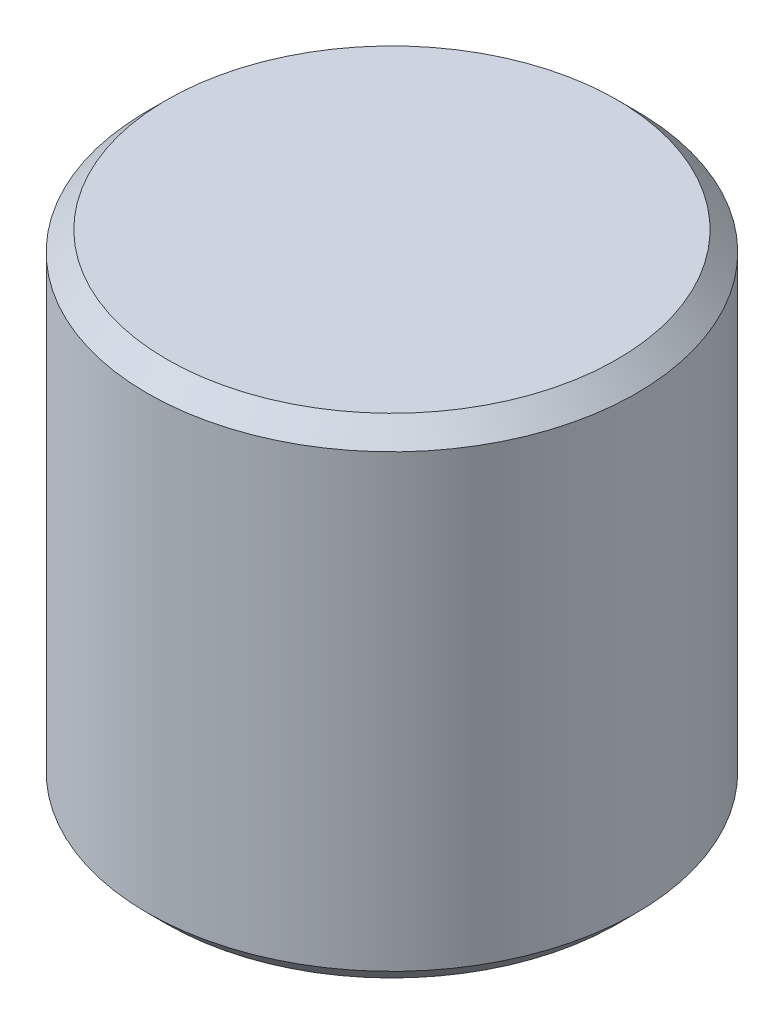
ISO-10303-21;
HEADER;
FILE_DESCRIPTION(('STEP AP214'),'2;1');
FILE_NAME('part.step','',(''),(''),'','','');
FILE_SCHEMA(('AUTOMOTIVE_DESIGN { 1 0 10303 214 1 1 1 1 }'));
ENDSEC;
DATA;
#1=APPLICATION_CONTEXT('core data for automotive mechanical design processes');
#2=APPLICATION_PROTOCOL_DEFINITION('international standard','automotive_design',2000,#1);
#3=PRODUCT_CONTEXT('',#1,'mechanical');
#4=PRODUCT('Part','Part','',(#3));
#5=PRODUCT_RELATED_PRODUCT_CATEGORY('part','',(#4));
#6=PRODUCT_DEFINITION_FORMATION('','',#4);
#7=PRODUCT_DEFINITION_CONTEXT('part definition',#1,'design');
#8=PRODUCT_DEFINITION('design','',#6,#7);
#9=PRODUCT_DEFINITION_SHAPE('','',#8);
#10=(LENGTH_UNIT() NAMED_UNIT(*) SI_UNIT(.MILLI.,.METRE.));
#11=(NAMED_UNIT(*) PLANE_ANGLE_UNIT() SI_UNIT($,.RADIAN.));
#12=(NAMED_UNIT(*) SI_UNIT($,.STERADIAN.) SOLID_ANGLE_UNIT());
#13=UNCERTAINTY_MEASURE_WITH_UNIT(LENGTH_MEASURE(1.E-05),#10,'distance_accuracy_value','');
#14=(GEOMETRIC_REPRESENTATION_CONTEXT(3) GLOBAL_UNCERTAINTY_ASSIGNED_CONTEXT((#13)) GLOBAL_UNIT_ASSIGNED_CONTEXT((#10,
#11,#12)) REPRESENTATION_CONTEXT('',''));
#15=CARTESIAN_POINT('',(0.,0.,0.));
#16=DIRECTION('',(0.,0.,1.));
#17=DIRECTION('',(1.,0.,0.));
#18=AXIS2_PLACEMENT_3D('',#15,#16,#17);
#19=CARTESIAN_POINT('',(0.,15.875,0.));
#20=DIRECTION('',(0.,-1.,0.));
#21=DIRECTION('',(0.,0.,-1.));
#22=AXIS2_PLACEMENT_3D('',#19,#20,#21);
#23=CYLINDRICAL_SURFACE('',#22,7.9375);
#24=CARTESIAN_POINT('',(0.,0.634999999999995,0.));
#25=DIRECTION('',(0.,1.,0.));
#26=DIRECTION('',(0.,0.,1.));
#27=AXIS2_PLACEMENT_3D('',#24,#25,#26);
#28=CIRCLE('',#27,7.9375);
#29=CARTESIAN_POINT('',(0.,0.634999999999995,7.9375));
#30=VERTEX_POINT('',#29);
#31=EDGE_CURVE('E59',#30,#30,#28,.T.);
#32=ORIENTED_EDGE('',*,*,#31,.T.);
#33=EDGE_LOOP('',(#32));
#34=FACE_BOUND('',#33,.T.);
#35=CARTESIAN_POINT('',(0.,15.24,0.));
#36=DIRECTION('',(0.,1.,0.));
#37=DIRECTION('',(0.,0.,1.));
#38=AXIS2_PLACEMENT_3D('',#35,#36,#37);
#39=CIRCLE('',#38,7.9375);
#40=CARTESIAN_POINT('',(0.,15.24,7.9375));
#41=VERTEX_POINT('',#40);
#42=EDGE_CURVE('E64',#41,#41,#39,.F.);
#43=ORIENTED_EDGE('',*,*,#42,.T.);
#44=EDGE_LOOP('',(#43));
#45=FACE_BOUND('',#44,.T.);
#46=ADVANCED_FACE('F45',(#34,#45),#23,.T.);
#47=CARTESIAN_POINT('',(0.,15.875,0.));
#48=DIRECTION('',(0.,1.,0.));
#49=DIRECTION('',(0.,0.,1.));
#50=AXIS2_PLACEMENT_3D('',#47,#48,#49);
#51=PLANE('',#50);
#52=CARTESIAN_POINT('',(0.,15.875,0.));
#53=DIRECTION('',(0.,1.,0.));
#54=DIRECTION('',(0.,0.,1.));
#55=AXIS2_PLACEMENT_3D('',#52,#53,#54);
#56=CIRCLE('',#55,7.3025);
#57=CARTESIAN_POINT('',(0.,15.875,7.3025));
#58=VERTEX_POINT('',#57);
#59=EDGE_CURVE('E10',#58,#58,#56,.T.);
#60=ORIENTED_EDGE('',*,*,#59,.T.);
#61=EDGE_LOOP('',(#60));
#62=FACE_BOUND('',#61,.T.);
#63=ADVANCED_FACE('F81',(#62),#51,.T.);
#64=CARTESIAN_POINT('',(0.,0.,0.));
#65=DIRECTION('',(0.,1.,0.));
#66=DIRECTION('',(0.,0.,1.));
#67=AXIS2_PLACEMENT_3D('',#64,#65,#66);
#68=PLANE('',#67);
#69=CARTESIAN_POINT('',(0.,0.,0.));
#70=DIRECTION('',(0.,1.,0.));
#71=DIRECTION('',(0.,0.,1.));
#72=AXIS2_PLACEMENT_3D('',#69,#70,#71);
#73=CIRCLE('',#72,7.3025);
#74=CARTESIAN_POINT('',(0.,0.,7.3025));
#75=VERTEX_POINT('',#74);
#76=EDGE_CURVE('E54',#75,#75,#73,.F.);
#77=ORIENTED_EDGE('',*,*,#76,.T.);
#78=EDGE_LOOP('',(#77));
#79=FACE_BOUND('',#78,.T.);
#80=ADVANCED_FACE('F78',(#79),#68,.F.);
#81=CARTESIAN_POINT('',(0.,0.634999999999995,0.));
#82=DIRECTION('',(0.,1.,0.));
#83=DIRECTION('',(0.,0.,1.));
#84=AXIS2_PLACEMENT_3D('',#81,#82,#83);
#85=CONICAL_SURFACE('',#84,7.9375,0.785398163397451);
#86=ORIENTED_EDGE('',*,*,#76,.F.);
#87=EDGE_LOOP('',(#86));
#88=FACE_BOUND('',#87,.T.);
#89=ORIENTED_EDGE('',*,*,#31,.F.);
#90=EDGE_LOOP('',(#89));
#91=FACE_BOUND('',#90,.T.);
#92=ADVANCED_FACE('F74',(#88,#91),#85,.T.);
#93=CARTESIAN_POINT('',(0.,15.875,0.));
#94=DIRECTION('',(0.,-1.,0.));
#95=DIRECTION('',(0.,0.,-1.));
#96=AXIS2_PLACEMENT_3D('',#93,#94,#95);
#97=CONICAL_SURFACE('',#96,7.3025,0.785398163397444);
#98=ORIENTED_EDGE('',*,*,#42,.F.);
#99=EDGE_LOOP('',(#98));
#100=FACE_BOUND('',#99,.T.);
#101=ORIENTED_EDGE('',*,*,#59,.F.);
#102=EDGE_LOOP('',(#101));
#103=FACE_BOUND('',#102,.T.);
#104=ADVANCED_FACE('F48',(#100,#103),#97,.T.);
#105=CLOSED_SHELL('',(#46,#63,#80,#92,#104));
#106=MANIFOLD_SOLID_BREP('B2',#105);
#107=ADVANCED_BREP_SHAPE_REPRESENTATION('',(#18,#106),#14);
#108=SHAPE_DEFINITION_REPRESENTATION(#9,#107);
ENDSEC;
END-ISO-10303-21;
